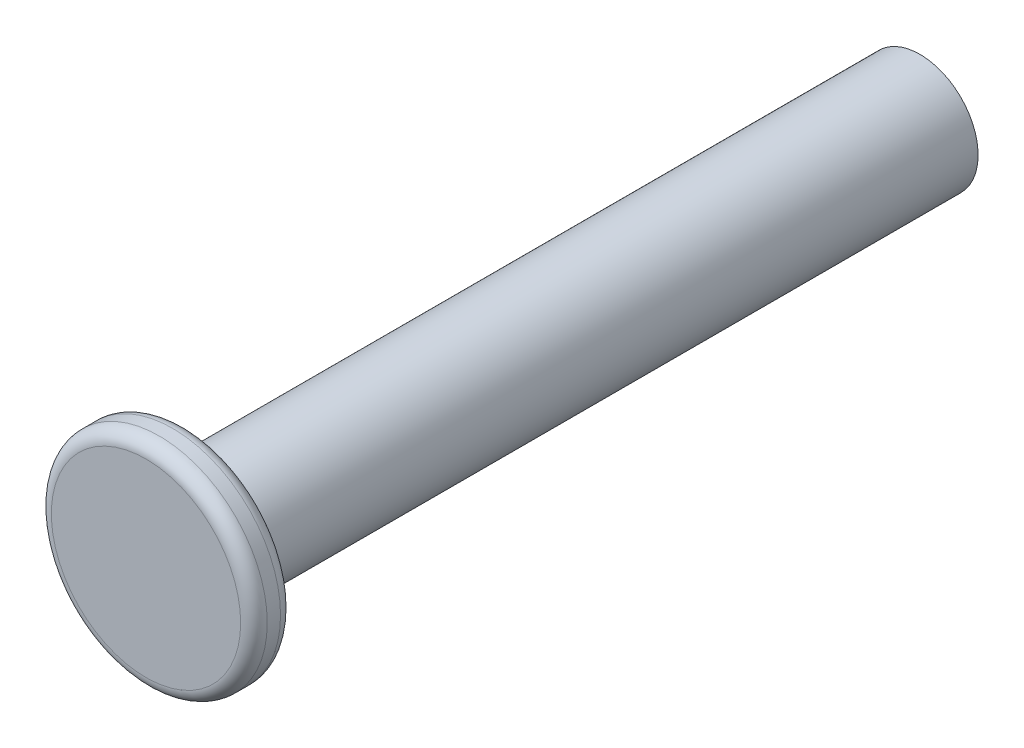
ISO-10303-21;
HEADER;
FILE_DESCRIPTION(('STEP AP214'),'2;1');
FILE_NAME('part.step','',(''),(''),'','','');
FILE_SCHEMA(('AUTOMOTIVE_DESIGN { 1 0 10303 214 1 1 1 1 }'));
ENDSEC;
DATA;
#1=APPLICATION_CONTEXT('core data for automotive mechanical design processes');
#2=APPLICATION_PROTOCOL_DEFINITION('international standard','automotive_design',2000,#1);
#3=PRODUCT_CONTEXT('',#1,'mechanical');
#4=PRODUCT('Part','Part','',(#3));
#5=PRODUCT_RELATED_PRODUCT_CATEGORY('part','',(#4));
#6=PRODUCT_DEFINITION_FORMATION('','',#4);
#7=PRODUCT_DEFINITION_CONTEXT('part definition',#1,'design');
#8=PRODUCT_DEFINITION('design','',#6,#7);
#9=PRODUCT_DEFINITION_SHAPE('','',#8);
#10=(LENGTH_UNIT() NAMED_UNIT(*) SI_UNIT(.MILLI.,.METRE.));
#11=(NAMED_UNIT(*) PLANE_ANGLE_UNIT() SI_UNIT($,.RADIAN.));
#12=(NAMED_UNIT(*) SI_UNIT($,.STERADIAN.) SOLID_ANGLE_UNIT());
#13=UNCERTAINTY_MEASURE_WITH_UNIT(LENGTH_MEASURE(1.E-05),#10,'distance_accuracy_value','');
#14=(GEOMETRIC_REPRESENTATION_CONTEXT(3) GLOBAL_UNCERTAINTY_ASSIGNED_CONTEXT((#13)) GLOBAL_UNIT_ASSIGNED_CONTEXT((#10,
#11,#12)) REPRESENTATION_CONTEXT('',''));
#15=CARTESIAN_POINT('',(0.,0.,0.));
#16=DIRECTION('',(0.,0.,1.));
#17=DIRECTION('',(1.,0.,0.));
#18=AXIS2_PLACEMENT_3D('',#15,#16,#17);
#19=CARTESIAN_POINT('',(0.,0.,1.2));
#20=DIRECTION('',(0.,0.,-1.));
#21=DIRECTION('',(-1.,0.,0.));
#22=AXIS2_PLACEMENT_3D('',#19,#20,#21);
#23=CYLINDRICAL_SURFACE('',#22,3.25);
#24=CARTESIAN_POINT('',(0.,0.,0.8));
#25=DIRECTION('',(0.,0.,1.));
#26=DIRECTION('',(1.,0.,0.));
#27=AXIS2_PLACEMENT_3D('',#24,#25,#26);
#28=CIRCLE('',#27,3.25);
#29=CARTESIAN_POINT('',(3.25,0.,0.8));
#30=VERTEX_POINT('',#29);
#31=EDGE_CURVE('E41',#30,#30,#28,.F.);
#32=ORIENTED_EDGE('',*,*,#31,.T.);
#33=EDGE_LOOP('',(#32));
#34=FACE_BOUND('',#33,.T.);
#35=CARTESIAN_POINT('',(0.,0.,0.4));
#36=DIRECTION('',(0.,0.,1.));
#37=DIRECTION('',(1.,0.,0.));
#38=AXIS2_PLACEMENT_3D('',#35,#36,#37);
#39=CIRCLE('',#38,3.25);
#40=CARTESIAN_POINT('',(3.25,0.,0.4));
#41=VERTEX_POINT('',#40);
#42=EDGE_CURVE('E45',#41,#41,#39,.T.);
#43=ORIENTED_EDGE('',*,*,#42,.T.);
#44=EDGE_LOOP('',(#43));
#45=FACE_BOUND('',#44,.T.);
#46=ADVANCED_FACE('F34',(#34,#45),#23,.T.);
#47=CARTESIAN_POINT('',(0.,0.,1.2));
#48=DIRECTION('',(0.,0.,1.));
#49=DIRECTION('',(1.,0.,0.));
#50=AXIS2_PLACEMENT_3D('',#47,#48,#49);
#51=PLANE('',#50);
#52=CARTESIAN_POINT('',(0.,0.,1.2));
#53=DIRECTION('',(0.,0.,1.));
#54=DIRECTION('',(1.,0.,0.));
#55=AXIS2_PLACEMENT_3D('',#52,#53,#54);
#56=CIRCLE('',#55,2.85);
#57=CARTESIAN_POINT('',(2.85,0.,1.2));
#58=VERTEX_POINT('',#57);
#59=EDGE_CURVE('E49',#58,#58,#56,.T.);
#60=ORIENTED_EDGE('',*,*,#59,.T.);
#61=EDGE_LOOP('',(#60));
#62=FACE_BOUND('',#61,.T.);
#63=ADVANCED_FACE('F71',(#62),#51,.T.);
#64=CARTESIAN_POINT('',(0.,0.,0.));
#65=DIRECTION('',(0.,0.,1.));
#66=DIRECTION('',(1.,0.,0.));
#67=AXIS2_PLACEMENT_3D('',#64,#65,#66);
#68=PLANE('',#67);
#69=CARTESIAN_POINT('',(0.,0.,0.));
#70=DIRECTION('',(0.,0.,1.));
#71=DIRECTION('',(1.,0.,0.));
#72=AXIS2_PLACEMENT_3D('',#69,#70,#71);
#73=CIRCLE('',#72,2.85);
#74=CARTESIAN_POINT('',(2.85,0.,0.));
#75=VERTEX_POINT('',#74);
#76=EDGE_CURVE('E10',#75,#75,#73,.F.);
#77=ORIENTED_EDGE('',*,*,#76,.T.);
#78=EDGE_LOOP('',(#77));
#79=FACE_BOUND('',#78,.T.);
#80=CARTESIAN_POINT('',(0.,0.,0.));
#81=DIRECTION('',(0.,0.,-1.));
#82=DIRECTION('',(-1.,0.,0.));
#83=AXIS2_PLACEMENT_3D('',#80,#81,#82);
#84=CIRCLE('',#83,1.75);
#85=CARTESIAN_POINT('',(-1.75,0.,0.));
#86=VERTEX_POINT('',#85);
#87=EDGE_CURVE('E54',#86,#86,#84,.T.);
#88=ORIENTED_EDGE('',*,*,#87,.F.);
#89=EDGE_LOOP('',(#88));
#90=FACE_BOUND('',#89,.T.);
#91=ADVANCED_FACE('F66',(#79,#90),#68,.F.);
#92=CARTESIAN_POINT('',(0.,0.,-22.1));
#93=DIRECTION('',(0.,0.,1.));
#94=DIRECTION('',(1.,0.,0.));
#95=AXIS2_PLACEMENT_3D('',#92,#93,#94);
#96=CYLINDRICAL_SURFACE('',#95,1.75);
#97=CARTESIAN_POINT('',(0.,0.,-22.1));
#98=DIRECTION('',(0.,0.,-1.));
#99=DIRECTION('',(-1.,0.,0.));
#100=AXIS2_PLACEMENT_3D('',#97,#98,#99);
#101=CIRCLE('',#100,1.75);
#102=CARTESIAN_POINT('',(-1.75,0.,-22.1));
#103=VERTEX_POINT('',#102);
#104=EDGE_CURVE('E57',#103,#103,#101,.T.);
#105=ORIENTED_EDGE('',*,*,#104,.F.);
#106=EDGE_LOOP('',(#105));
#107=FACE_BOUND('',#106,.T.);
#108=ORIENTED_EDGE('',*,*,#87,.T.);
#109=EDGE_LOOP('',(#108));
#110=FACE_BOUND('',#109,.T.);
#111=ADVANCED_FACE('F63',(#107,#110),#96,.T.);
#112=CARTESIAN_POINT('',(0.,0.,-22.1));
#113=DIRECTION('',(0.,0.,-1.));
#114=DIRECTION('',(-1.,0.,0.));
#115=AXIS2_PLACEMENT_3D('',#112,#113,#114);
#116=PLANE('',#115);
#117=ORIENTED_EDGE('',*,*,#104,.T.);
#118=EDGE_LOOP('',(#117));
#119=FACE_BOUND('',#118,.T.);
#120=ADVANCED_FACE('F61',(#119),#116,.T.);
#121=CARTESIAN_POINT('',(0.,0.,0.8));
#122=DIRECTION('',(0.,0.,1.));
#123=DIRECTION('',(1.,0.,0.));
#124=AXIS2_PLACEMENT_3D('',#121,#122,#123);
#125=TOROIDAL_SURFACE('',#124,2.85,0.4);
#126=ORIENTED_EDGE('',*,*,#31,.F.);
#127=EDGE_LOOP('',(#126));
#128=FACE_BOUND('',#127,.T.);
#129=ORIENTED_EDGE('',*,*,#59,.F.);
#130=EDGE_LOOP('',(#129));
#131=FACE_BOUND('',#130,.T.);
#132=ADVANCED_FACE('F83',(#128,#131),#125,.T.);
#133=CARTESIAN_POINT('',(0.,0.,0.4));
#134=DIRECTION('',(0.,0.,1.));
#135=DIRECTION('',(1.,0.,0.));
#136=AXIS2_PLACEMENT_3D('',#133,#134,#135);
#137=TOROIDAL_SURFACE('',#136,2.85,0.4);
#138=ORIENTED_EDGE('',*,*,#76,.F.);
#139=EDGE_LOOP('',(#138));
#140=FACE_BOUND('',#139,.T.);
#141=ORIENTED_EDGE('',*,*,#42,.F.);
#142=EDGE_LOOP('',(#141));
#143=FACE_BOUND('',#142,.T.);
#144=ADVANCED_FACE('F36',(#140,#143),#137,.T.);
#145=CLOSED_SHELL('',(#46,#63,#91,#111,#120,#132,#144));
#146=MANIFOLD_SOLID_BREP('B2',#145);
#147=ADVANCED_BREP_SHAPE_REPRESENTATION('',(#18,#146),#14);
#148=SHAPE_DEFINITION_REPRESENTATION(#9,#147);
ENDSEC;
END-ISO-10303-21;
